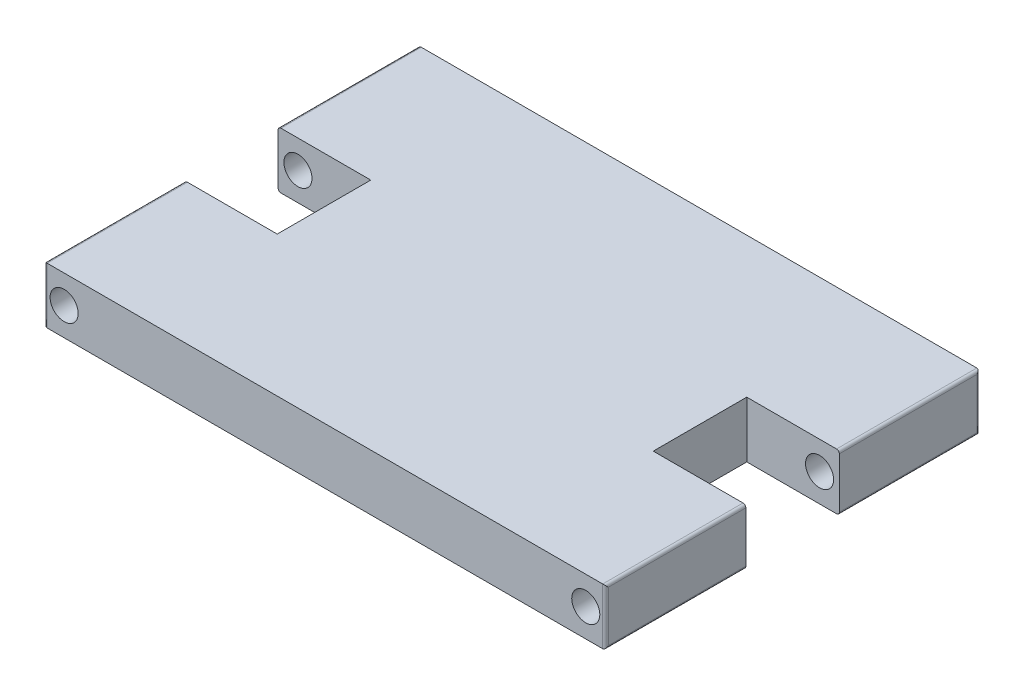
ISO-10303-21;
HEADER;
FILE_DESCRIPTION(('STEP AP214'),'2;1');
FILE_NAME('part.step','',(''),(''),'','','');
FILE_SCHEMA(('AUTOMOTIVE_DESIGN { 1 0 10303 214 1 1 1 1 }'));
ENDSEC;
DATA;
#1=APPLICATION_CONTEXT('core data for automotive mechanical design processes');
#2=APPLICATION_PROTOCOL_DEFINITION('international standard','automotive_design',2000,#1);
#3=PRODUCT_CONTEXT('',#1,'mechanical');
#4=PRODUCT('Part','Part','',(#3));
#5=PRODUCT_RELATED_PRODUCT_CATEGORY('part','',(#4));
#6=PRODUCT_DEFINITION_FORMATION('','',#4);
#7=PRODUCT_DEFINITION_CONTEXT('part definition',#1,'design');
#8=PRODUCT_DEFINITION('design','',#6,#7);
#9=PRODUCT_DEFINITION_SHAPE('','',#8);
#10=(LENGTH_UNIT() NAMED_UNIT(*) SI_UNIT(.MILLI.,.METRE.));
#11=(NAMED_UNIT(*) PLANE_ANGLE_UNIT() SI_UNIT($,.RADIAN.));
#12=(NAMED_UNIT(*) SI_UNIT($,.STERADIAN.) SOLID_ANGLE_UNIT());
#13=UNCERTAINTY_MEASURE_WITH_UNIT(LENGTH_MEASURE(1.E-05),#10,'distance_accuracy_value','');
#14=(GEOMETRIC_REPRESENTATION_CONTEXT(3) GLOBAL_UNCERTAINTY_ASSIGNED_CONTEXT((#13)) GLOBAL_UNIT_ASSIGNED_CONTEXT((#10,
#11,#12)) REPRESENTATION_CONTEXT('',''));
#15=CARTESIAN_POINT('',(0.,0.,0.));
#16=DIRECTION('',(0.,0.,1.));
#17=DIRECTION('',(1.,0.,0.));
#18=AXIS2_PLACEMENT_3D('',#15,#16,#17);
#19=CARTESIAN_POINT('',(0.,60.,-3.00000000000002));
#20=DIRECTION('',(1.,0.,0.));
#21=DIRECTION('',(0.,0.,-1.));
#22=AXIS2_PLACEMENT_3D('',#19,#20,#21);
#23=PLANE('',#22);
#24=DIRECTION('',(0.,1.,0.));
#25=VECTOR('',#24,1.);
#26=CARTESIAN_POINT('',(0.,60.,-150.));
#27=LINE('',#26,#25);
#28=CARTESIAN_POINT('',(0.,3.,-150.));
#29=VERTEX_POINT('',#28);
#30=CARTESIAN_POINT('',(0.,56.9999999999999,-150.));
#31=VERTEX_POINT('',#30);
#32=EDGE_CURVE('E280',#29,#31,#27,.T.);
#33=ORIENTED_EDGE('',*,*,#32,.F.);
#34=DIRECTION('',(0.,0.,1.));
#35=VECTOR('',#34,1.);
#36=CARTESIAN_POINT('',(0.,3.00000000000002,-400.));
#37=LINE('',#36,#35);
#38=CARTESIAN_POINT('',(0.,3.00000000000002,-3.));
#39=VERTEX_POINT('',#38);
#40=EDGE_CURVE('E297',#29,#39,#37,.T.);
#41=ORIENTED_EDGE('',*,*,#40,.T.);
#42=DIRECTION('',(0.,-1.,0.));
#43=VECTOR('',#42,1.);
#44=CARTESIAN_POINT('',(0.,60.,-3.00000000000002));
#45=LINE('',#44,#43);
#46=CARTESIAN_POINT('',(0.,56.9999999999999,-3.));
#47=VERTEX_POINT('',#46);
#48=EDGE_CURVE('E436',#47,#39,#45,.T.);
#49=ORIENTED_EDGE('',*,*,#48,.F.);
#50=DIRECTION('',(0.,0.,1.));
#51=VECTOR('',#50,1.);
#52=CARTESIAN_POINT('',(0.,56.9999999999999,-400.));
#53=LINE('',#52,#51);
#54=EDGE_CURVE('E298',#31,#47,#53,.T.);
#55=ORIENTED_EDGE('',*,*,#54,.F.);
#56=EDGE_LOOP('',(#33,#41,#49,#55));
#57=FACE_BOUND('',#56,.T.);
#58=ADVANCED_FACE('F40',(#57),#23,.F.);
#59=DIRECTION('',(0.,-1.,0.));
#60=VECTOR('',#59,1.);
#61=CARTESIAN_POINT('',(0.,60.,-250.));
#62=LINE('',#61,#60);
#63=CARTESIAN_POINT('',(0.,56.9999999999999,-250.));
#64=VERTEX_POINT('',#63);
#65=CARTESIAN_POINT('',(0.,3.,-250.));
#66=VERTEX_POINT('',#65);
#67=EDGE_CURVE('E266',#64,#66,#62,.T.);
#68=ORIENTED_EDGE('',*,*,#67,.F.);
#69=CARTESIAN_POINT('',(0.,56.9999999999999,-397.));
#70=VERTEX_POINT('',#69);
#71=EDGE_CURVE('E293',#70,#64,#53,.T.);
#72=ORIENTED_EDGE('',*,*,#71,.F.);
#73=DIRECTION('',(0.,-1.,0.));
#74=VECTOR('',#73,1.);
#75=CARTESIAN_POINT('',(0.,60.,-397.));
#76=LINE('',#75,#74);
#77=CARTESIAN_POINT('',(0.,3.00000000000002,-397.));
#78=VERTEX_POINT('',#77);
#79=EDGE_CURVE('E440',#70,#78,#76,.T.);
#80=ORIENTED_EDGE('',*,*,#79,.T.);
#81=EDGE_CURVE('E299',#78,#66,#37,.T.);
#82=ORIENTED_EDGE('',*,*,#81,.T.);
#83=EDGE_LOOP('',(#68,#72,#80,#82));
#84=FACE_BOUND('',#83,.T.);
#85=ADVANCED_FACE('F486',(#84),#23,.F.);
#86=CARTESIAN_POINT('',(600.,60.,-3.));
#87=DIRECTION('',(-1.,0.,0.));
#88=DIRECTION('',(0.,0.,1.));
#89=AXIS2_PLACEMENT_3D('',#86,#87,#88);
#90=PLANE('',#89);
#91=DIRECTION('',(0.,-1.,0.));
#92=VECTOR('',#91,1.);
#93=CARTESIAN_POINT('',(600.,60.,-150.));
#94=LINE('',#93,#92);
#95=CARTESIAN_POINT('',(600.,57.,-150.));
#96=VERTEX_POINT('',#95);
#97=CARTESIAN_POINT('',(600.,3.,-150.));
#98=VERTEX_POINT('',#97);
#99=EDGE_CURVE('E253',#96,#98,#94,.T.);
#100=ORIENTED_EDGE('',*,*,#99,.F.);
#101=DIRECTION('',(0.,0.,1.));
#102=VECTOR('',#101,1.);
#103=CARTESIAN_POINT('',(600.,57.,-400.));
#104=LINE('',#103,#102);
#105=CARTESIAN_POINT('',(600.,57.,-3.));
#106=VERTEX_POINT('',#105);
#107=EDGE_CURVE('E400',#96,#106,#104,.T.);
#108=ORIENTED_EDGE('',*,*,#107,.T.);
#109=DIRECTION('',(0.,-1.,0.));
#110=VECTOR('',#109,1.);
#111=CARTESIAN_POINT('',(600.,60.,-3.));
#112=LINE('',#111,#110);
#113=CARTESIAN_POINT('',(600.,3.,-3.));
#114=VERTEX_POINT('',#113);
#115=EDGE_CURVE('E429',#106,#114,#112,.T.);
#116=ORIENTED_EDGE('',*,*,#115,.T.);
#117=DIRECTION('',(0.,0.,1.));
#118=VECTOR('',#117,1.);
#119=CARTESIAN_POINT('',(600.,3.,-400.));
#120=LINE('',#119,#118);
#121=EDGE_CURVE('E410',#98,#114,#120,.T.);
#122=ORIENTED_EDGE('',*,*,#121,.F.);
#123=EDGE_LOOP('',(#100,#108,#116,#122));
#124=FACE_BOUND('',#123,.T.);
#125=ADVANCED_FACE('F492',(#124),#90,.F.);
#126=DIRECTION('',(0.,1.,0.));
#127=VECTOR('',#126,1.);
#128=CARTESIAN_POINT('',(600.,60.,-250.));
#129=LINE('',#128,#127);
#130=CARTESIAN_POINT('',(600.,3.,-250.));
#131=VERTEX_POINT('',#130);
#132=CARTESIAN_POINT('',(600.,57.,-250.));
#133=VERTEX_POINT('',#132);
#134=EDGE_CURVE('E67',#131,#133,#129,.T.);
#135=ORIENTED_EDGE('',*,*,#134,.F.);
#136=CARTESIAN_POINT('',(600.,3.,-397.));
#137=VERTEX_POINT('',#136);
#138=EDGE_CURVE('E305',#137,#131,#120,.T.);
#139=ORIENTED_EDGE('',*,*,#138,.F.);
#140=DIRECTION('',(0.,-1.,0.));
#141=VECTOR('',#140,1.);
#142=CARTESIAN_POINT('',(600.,60.,-397.));
#143=LINE('',#142,#141);
#144=CARTESIAN_POINT('',(600.,57.,-397.));
#145=VERTEX_POINT('',#144);
#146=EDGE_CURVE('E332',#145,#137,#143,.T.);
#147=ORIENTED_EDGE('',*,*,#146,.F.);
#148=EDGE_CURVE('E397',#145,#133,#104,.T.);
#149=ORIENTED_EDGE('',*,*,#148,.T.);
#150=EDGE_LOOP('',(#135,#139,#147,#149));
#151=FACE_BOUND('',#150,.T.);
#152=ADVANCED_FACE('F547',(#151),#90,.F.);
#153=CARTESIAN_POINT('',(597.,60.,-397.));
#154=DIRECTION('',(0.,-1.,0.));
#155=DIRECTION('',(0.,0.,-1.));
#156=AXIS2_PLACEMENT_3D('',#153,#154,#155);
#157=PLANE('',#156);
#158=DIRECTION('',(1.,0.,0.));
#159=VECTOR('',#158,1.);
#160=CARTESIAN_POINT('',(597.,60.,-150.));
#161=LINE('',#160,#159);
#162=CARTESIAN_POINT('',(3.,59.9999999999999,-150.));
#163=VERTEX_POINT('',#162);
#164=CARTESIAN_POINT('',(99.,60.,-150.));
#165=VERTEX_POINT('',#164);
#166=EDGE_CURVE('E189',#163,#165,#161,.T.);
#167=ORIENTED_EDGE('',*,*,#166,.F.);
#168=DIRECTION('',(0.,0.,1.));
#169=VECTOR('',#168,1.);
#170=CARTESIAN_POINT('',(3.,60.,-400.));
#171=LINE('',#170,#169);
#172=CARTESIAN_POINT('',(3.00000000000001,60.,0.));
#173=VERTEX_POINT('',#172);
#174=EDGE_CURVE('E364',#163,#173,#171,.T.);
#175=ORIENTED_EDGE('',*,*,#174,.T.);
#176=DIRECTION('',(1.,0.,0.));
#177=VECTOR('',#176,1.);
#178=CARTESIAN_POINT('',(597.,60.,0.));
#179=LINE('',#178,#177);
#180=CARTESIAN_POINT('',(597.,60.,0.));
#181=VERTEX_POINT('',#180);
#182=EDGE_CURVE('E328',#173,#181,#179,.T.);
#183=ORIENTED_EDGE('',*,*,#182,.T.);
#184=DIRECTION('',(0.,0.,1.));
#185=VECTOR('',#184,1.);
#186=CARTESIAN_POINT('',(597.,59.9999999999999,-400.));
#187=LINE('',#186,#185);
#188=CARTESIAN_POINT('',(597.,59.9999999999999,-150.));
#189=VERTEX_POINT('',#188);
#190=EDGE_CURVE('E292',#189,#181,#187,.T.);
#191=ORIENTED_EDGE('',*,*,#190,.F.);
#192=DIRECTION('',(1.,0.,0.));
#193=VECTOR('',#192,1.);
#194=CARTESIAN_POINT('',(597.,60.,-150.));
#195=LINE('',#194,#193);
#196=CARTESIAN_POINT('',(501.,60.,-150.));
#197=VERTEX_POINT('',#196);
#198=EDGE_CURVE('E250',#197,#189,#195,.T.);
#199=ORIENTED_EDGE('',*,*,#198,.F.);
#200=DIRECTION('',(0.,0.,1.));
#201=VECTOR('',#200,1.);
#202=CARTESIAN_POINT('',(501.,60.,-397.));
#203=LINE('',#202,#201);
#204=CARTESIAN_POINT('',(501.,60.,-250.));
#205=VERTEX_POINT('',#204);
#206=EDGE_CURVE('E286',#205,#197,#203,.T.);
#207=ORIENTED_EDGE('',*,*,#206,.F.);
#208=DIRECTION('',(-1.,0.,0.));
#209=VECTOR('',#208,1.);
#210=CARTESIAN_POINT('',(597.,60.,-250.));
#211=LINE('',#210,#209);
#212=CARTESIAN_POINT('',(597.,59.9999999999999,-250.));
#213=VERTEX_POINT('',#212);
#214=EDGE_CURVE('E236',#213,#205,#211,.T.);
#215=ORIENTED_EDGE('',*,*,#214,.F.);
#216=CARTESIAN_POINT('',(597.,60.,-400.));
#217=VERTEX_POINT('',#216);
#218=EDGE_CURVE('E360',#217,#213,#187,.T.);
#219=ORIENTED_EDGE('',*,*,#218,.F.);
#220=DIRECTION('',(-1.,0.,0.));
#221=VECTOR('',#220,1.);
#222=CARTESIAN_POINT('',(3.,60.,-400.));
#223=LINE('',#222,#221);
#224=CARTESIAN_POINT('',(3.,60.,-400.));
#225=VERTEX_POINT('',#224);
#226=EDGE_CURVE('E333',#217,#225,#223,.T.);
#227=ORIENTED_EDGE('',*,*,#226,.T.);
#228=CARTESIAN_POINT('',(3.,60.,-250.));
#229=VERTEX_POINT('',#228);
#230=EDGE_CURVE('E371',#225,#229,#171,.T.);
#231=ORIENTED_EDGE('',*,*,#230,.T.);
#232=DIRECTION('',(-1.,0.,0.));
#233=VECTOR('',#232,1.);
#234=CARTESIAN_POINT('',(597.,60.,-250.));
#235=LINE('',#234,#233);
#236=CARTESIAN_POINT('',(99.,60.,-250.));
#237=VERTEX_POINT('',#236);
#238=EDGE_CURVE('E59',#237,#229,#235,.T.);
#239=ORIENTED_EDGE('',*,*,#238,.F.);
#240=DIRECTION('',(0.,0.,-1.));
#241=VECTOR('',#240,1.);
#242=CARTESIAN_POINT('',(99.,60.,-397.));
#243=LINE('',#242,#241);
#244=EDGE_CURVE('E289',#165,#237,#243,.T.);
#245=ORIENTED_EDGE('',*,*,#244,.F.);
#246=EDGE_LOOP('',(#167,#175,#183,#191,#199,#207,#215,#219,#227,#231,#239,#245));
#247=FACE_BOUND('',#246,.T.);
#248=ADVANCED_FACE('F527',(#247),#157,.F.);
#249=CARTESIAN_POINT('',(597.,0.,-397.));
#250=DIRECTION('',(0.,-1.,0.));
#251=DIRECTION('',(0.,0.,-1.));
#252=AXIS2_PLACEMENT_3D('',#249,#250,#251);
#253=PLANE('',#252);
#254=DIRECTION('',(0.,0.,1.));
#255=VECTOR('',#254,1.);
#256=CARTESIAN_POINT('',(3.00000000000002,0.,-400.));
#257=LINE('',#256,#255);
#258=CARTESIAN_POINT('',(3.,0.,-150.));
#259=VERTEX_POINT('',#258);
#260=CARTESIAN_POINT('',(3.,0.,1.19999999968419E-05));
#261=VERTEX_POINT('',#260);
#262=EDGE_CURVE('E44',#259,#261,#257,.T.);
#263=ORIENTED_EDGE('',*,*,#262,.F.);
#264=DIRECTION('',(1.,0.,0.));
#265=VECTOR('',#264,1.);
#266=CARTESIAN_POINT('',(-0.999999999999969,0.,-150.));
#267=LINE('',#266,#265);
#268=CARTESIAN_POINT('',(99.,0.,-150.));
#269=VERTEX_POINT('',#268);
#270=EDGE_CURVE('E186',#259,#269,#267,.T.);
#271=ORIENTED_EDGE('',*,*,#270,.T.);
#272=DIRECTION('',(0.,0.,-1.));
#273=VECTOR('',#272,1.);
#274=CARTESIAN_POINT('',(99.,0.,-250.));
#275=LINE('',#274,#273);
#276=CARTESIAN_POINT('',(99.,0.,-250.));
#277=VERTEX_POINT('',#276);
#278=EDGE_CURVE('E197',#269,#277,#275,.T.);
#279=ORIENTED_EDGE('',*,*,#278,.T.);
#280=DIRECTION('',(-1.,0.,0.));
#281=VECTOR('',#280,1.);
#282=CARTESIAN_POINT('',(-0.999999999999981,0.,-250.));
#283=LINE('',#282,#281);
#284=CARTESIAN_POINT('',(3.,0.,-250.));
#285=VERTEX_POINT('',#284);
#286=EDGE_CURVE('E203',#277,#285,#283,.T.);
#287=ORIENTED_EDGE('',*,*,#286,.T.);
#288=CARTESIAN_POINT('',(3.,0.,-400.));
#289=VERTEX_POINT('',#288);
#290=EDGE_CURVE('E315',#289,#285,#257,.T.);
#291=ORIENTED_EDGE('',*,*,#290,.F.);
#292=DIRECTION('',(-1.,0.,0.));
#293=VECTOR('',#292,1.);
#294=CARTESIAN_POINT('',(3.,0.,-400.));
#295=LINE('',#294,#293);
#296=CARTESIAN_POINT('',(597.,0.,-400.));
#297=VERTEX_POINT('',#296);
#298=EDGE_CURVE('E340',#297,#289,#295,.T.);
#299=ORIENTED_EDGE('',*,*,#298,.F.);
#300=DIRECTION('',(0.,0.,1.));
#301=VECTOR('',#300,1.);
#302=CARTESIAN_POINT('',(597.,0.,-400.));
#303=LINE('',#302,#301);
#304=CARTESIAN_POINT('',(597.,0.,-250.));
#305=VERTEX_POINT('',#304);
#306=EDGE_CURVE('E309',#297,#305,#303,.T.);
#307=ORIENTED_EDGE('',*,*,#306,.T.);
#308=DIRECTION('',(-1.,0.,0.));
#309=VECTOR('',#308,1.);
#310=CARTESIAN_POINT('',(501.,0.,-250.));
#311=LINE('',#310,#309);
#312=CARTESIAN_POINT('',(501.,0.,-250.));
#313=VERTEX_POINT('',#312);
#314=EDGE_CURVE('E227',#305,#313,#311,.T.);
#315=ORIENTED_EDGE('',*,*,#314,.T.);
#316=DIRECTION('',(0.,0.,1.));
#317=VECTOR('',#316,1.);
#318=CARTESIAN_POINT('',(501.,0.,-250.));
#319=LINE('',#318,#317);
#320=CARTESIAN_POINT('',(501.,0.,-150.));
#321=VERTEX_POINT('',#320);
#322=EDGE_CURVE('E219',#313,#321,#319,.T.);
#323=ORIENTED_EDGE('',*,*,#322,.T.);
#324=DIRECTION('',(1.,0.,0.));
#325=VECTOR('',#324,1.);
#326=CARTESIAN_POINT('',(501.,0.,-150.));
#327=LINE('',#326,#325);
#328=CARTESIAN_POINT('',(597.,0.,-150.));
#329=VERTEX_POINT('',#328);
#330=EDGE_CURVE('E223',#321,#329,#327,.T.);
#331=ORIENTED_EDGE('',*,*,#330,.T.);
#332=CARTESIAN_POINT('',(597.,0.,0.));
#333=VERTEX_POINT('',#332);
#334=EDGE_CURVE('E312',#329,#333,#303,.T.);
#335=ORIENTED_EDGE('',*,*,#334,.T.);
#336=DIRECTION('',(1.,0.,0.));
#337=VECTOR('',#336,1.);
#338=CARTESIAN_POINT('',(3.00000000000002,0.,0.));
#339=LINE('',#338,#337);
#340=EDGE_CURVE('E336',#261,#333,#339,.T.);
#341=ORIENTED_EDGE('',*,*,#340,.F.);
#342=EDGE_LOOP('',(#263,#271,#279,#287,#291,#299,#307,#315,#323,#331,#335,#341));
#343=FACE_BOUND('',#342,.T.);
#344=ADVANCED_FACE('F206',(#343),#253,.T.);
#345=CARTESIAN_POINT('',(3.,3.,-400.));
#346=DIRECTION('',(0.,0.,1.));
#347=DIRECTION('',(1.,0.,0.));
#348=AXIS2_PLACEMENT_3D('',#345,#346,#347);
#349=CYLINDRICAL_SURFACE('',#348,3.);
#350=ORIENTED_EDGE('',*,*,#40,.F.);
#351=CARTESIAN_POINT('',(3.,3.,-150.));
#352=DIRECTION('',(0.,0.,-1.));
#353=DIRECTION('',(-1.,0.,0.));
#354=AXIS2_PLACEMENT_3D('',#351,#352,#353);
#355=CIRCLE('',#354,3.);
#356=EDGE_CURVE('E283',#29,#259,#355,.F.);
#357=ORIENTED_EDGE('',*,*,#356,.T.);
#358=ORIENTED_EDGE('',*,*,#262,.T.);
#359=CARTESIAN_POINT('',(3.,3.,-3.));
#360=DIRECTION('',(0.,-0.707106781186547,-0.707106781186547));
#361=DIRECTION('',(0.,-0.707106781186547,0.707106781186547));
#362=AXIS2_PLACEMENT_3D('',#359,#360,#361);
#363=ELLIPSE('',#362,4.24264068711928,3.);
#364=EDGE_CURVE('E379',#261,#39,#363,.T.);
#365=ORIENTED_EDGE('',*,*,#364,.T.);
#366=EDGE_LOOP('',(#350,#357,#358,#365));
#367=FACE_BOUND('',#366,.T.);
#368=ADVANCED_FACE('F481',(#367),#349,.T.);
#369=ORIENTED_EDGE('',*,*,#290,.T.);
#370=CARTESIAN_POINT('',(3.,3.,-250.));
#371=DIRECTION('',(0.,0.,1.));
#372=DIRECTION('',(1.,0.,0.));
#373=AXIS2_PLACEMENT_3D('',#370,#371,#372);
#374=CIRCLE('',#373,3.);
#375=EDGE_CURVE('E269',#285,#66,#374,.F.);
#376=ORIENTED_EDGE('',*,*,#375,.T.);
#377=ORIENTED_EDGE('',*,*,#81,.F.);
#378=CARTESIAN_POINT('',(3.,3.,-397.));
#379=DIRECTION('',(0.,-0.707106781186547,0.707106781186547));
#380=DIRECTION('',(0.,-0.707106781186547,-0.707106781186547));
#381=AXIS2_PLACEMENT_3D('',#378,#379,#380);
#382=ELLIPSE('',#381,4.24264068711929,3.);
#383=EDGE_CURVE('E350',#78,#289,#382,.T.);
#384=ORIENTED_EDGE('',*,*,#383,.T.);
#385=EDGE_LOOP('',(#369,#376,#377,#384));
#386=FACE_BOUND('',#385,.T.);
#387=ADVANCED_FACE('F474',(#386),#349,.T.);
#388=CARTESIAN_POINT('',(597.,3.,-400.));
#389=DIRECTION('',(0.,0.,1.));
#390=DIRECTION('',(1.,0.,0.));
#391=AXIS2_PLACEMENT_3D('',#388,#389,#390);
#392=CYLINDRICAL_SURFACE('',#391,2.99999999999991);
#393=ORIENTED_EDGE('',*,*,#334,.F.);
#394=CARTESIAN_POINT('',(597.,3.,-150.));
#395=DIRECTION('',(0.,0.,-1.));
#396=DIRECTION('',(-1.,0.,0.));
#397=AXIS2_PLACEMENT_3D('',#394,#395,#396);
#398=CIRCLE('',#397,2.99999999999991);
#399=EDGE_CURVE('E256',#329,#98,#398,.F.);
#400=ORIENTED_EDGE('',*,*,#399,.T.);
#401=ORIENTED_EDGE('',*,*,#121,.T.);
#402=CARTESIAN_POINT('',(597.,3.,-3.));
#403=DIRECTION('',(0.,-0.707106781186547,-0.707106781186547));
#404=DIRECTION('',(0.,-0.707106781186547,0.707106781186547));
#405=AXIS2_PLACEMENT_3D('',#402,#403,#404);
#406=ELLIPSE('',#405,4.24264068711922,2.99999999999996);
#407=EDGE_CURVE('E345',#114,#333,#406,.T.);
#408=ORIENTED_EDGE('',*,*,#407,.T.);
#409=EDGE_LOOP('',(#393,#400,#401,#408));
#410=FACE_BOUND('',#409,.T.);
#411=ADVANCED_FACE('F472',(#410),#392,.T.);
#412=ORIENTED_EDGE('',*,*,#138,.T.);
#413=CARTESIAN_POINT('',(597.,3.,-250.));
#414=DIRECTION('',(0.,0.,1.));
#415=DIRECTION('',(1.,0.,0.));
#416=AXIS2_PLACEMENT_3D('',#413,#414,#415);
#417=CIRCLE('',#416,2.99999999999991);
#418=EDGE_CURVE('E241',#131,#305,#417,.F.);
#419=ORIENTED_EDGE('',*,*,#418,.T.);
#420=ORIENTED_EDGE('',*,*,#306,.F.);
#421=CARTESIAN_POINT('',(597.,3.,-397.));
#422=DIRECTION('',(0.,-0.707106781186547,0.707106781186547));
#423=DIRECTION('',(0.,-0.707106781186547,-0.707106781186547));
#424=AXIS2_PLACEMENT_3D('',#421,#422,#423);
#425=ELLIPSE('',#424,4.24264068711922,2.99999999999996);
#426=EDGE_CURVE('E349',#297,#137,#425,.T.);
#427=ORIENTED_EDGE('',*,*,#426,.T.);
#428=EDGE_LOOP('',(#412,#419,#420,#427));
#429=FACE_BOUND('',#428,.T.);
#430=ADVANCED_FACE('F423',(#429),#392,.T.);
#431=CARTESIAN_POINT('',(3.,56.9999999999999,-400.));
#432=DIRECTION('',(0.,0.,1.));
#433=DIRECTION('',(1.,0.,0.));
#434=AXIS2_PLACEMENT_3D('',#431,#432,#433);
#435=CYLINDRICAL_SURFACE('',#434,2.99999999999999);
#436=ORIENTED_EDGE('',*,*,#174,.F.);
#437=CARTESIAN_POINT('',(3.,56.9999999999999,-150.));
#438=DIRECTION('',(0.,0.,-1.));
#439=DIRECTION('',(-1.,0.,0.));
#440=AXIS2_PLACEMENT_3D('',#437,#438,#439);
#441=CIRCLE('',#440,2.99999999999999);
#442=EDGE_CURVE('E274',#163,#31,#441,.F.);
#443=ORIENTED_EDGE('',*,*,#442,.T.);
#444=ORIENTED_EDGE('',*,*,#54,.T.);
#445=CARTESIAN_POINT('',(3.,56.9999999999999,-3.));
#446=DIRECTION('',(0.,-0.707106781186547,0.707106781186547));
#447=DIRECTION('',(0.,-0.707106781186547,-0.707106781186547));
#448=AXIS2_PLACEMENT_3D('',#445,#446,#447);
#449=ELLIPSE('',#448,4.24264068711928,3.);
#450=EDGE_CURVE('E367',#47,#173,#449,.F.);
#451=ORIENTED_EDGE('',*,*,#450,.T.);
#452=EDGE_LOOP('',(#436,#443,#444,#451));
#453=FACE_BOUND('',#452,.T.);
#454=ADVANCED_FACE('F480',(#453),#435,.T.);
#455=ORIENTED_EDGE('',*,*,#71,.T.);
#456=CARTESIAN_POINT('',(3.,56.9999999999999,-250.));
#457=DIRECTION('',(0.,0.,1.));
#458=DIRECTION('',(1.,0.,0.));
#459=AXIS2_PLACEMENT_3D('',#456,#457,#458);
#460=CIRCLE('',#459,2.99999999999999);
#461=EDGE_CURVE('E261',#64,#229,#460,.F.);
#462=ORIENTED_EDGE('',*,*,#461,.T.);
#463=ORIENTED_EDGE('',*,*,#230,.F.);
#464=CARTESIAN_POINT('',(3.,56.9999999999999,-397.));
#465=DIRECTION('',(0.,-0.707106781186547,-0.707106781186547));
#466=DIRECTION('',(0.,-0.707106781186547,0.707106781186547));
#467=AXIS2_PLACEMENT_3D('',#464,#465,#466);
#468=ELLIPSE('',#467,4.24264068711928,3.);
#469=EDGE_CURVE('E359',#225,#70,#468,.F.);
#470=ORIENTED_EDGE('',*,*,#469,.T.);
#471=EDGE_LOOP('',(#455,#462,#463,#470));
#472=FACE_BOUND('',#471,.T.);
#473=ADVANCED_FACE('F569',(#472),#435,.T.);
#474=CARTESIAN_POINT('',(597.,57.,-400.));
#475=DIRECTION('',(0.,0.,1.));
#476=DIRECTION('',(1.,0.,0.));
#477=AXIS2_PLACEMENT_3D('',#474,#475,#476);
#478=CYLINDRICAL_SURFACE('',#477,2.99999999999991);
#479=ORIENTED_EDGE('',*,*,#107,.F.);
#480=CARTESIAN_POINT('',(597.,57.,-150.));
#481=DIRECTION('',(0.,0.,-1.));
#482=DIRECTION('',(-1.,0.,0.));
#483=AXIS2_PLACEMENT_3D('',#480,#481,#482);
#484=CIRCLE('',#483,2.99999999999991);
#485=EDGE_CURVE('E246',#96,#189,#484,.F.);
#486=ORIENTED_EDGE('',*,*,#485,.T.);
#487=ORIENTED_EDGE('',*,*,#190,.T.);
#488=CARTESIAN_POINT('',(597.,57.,-3.));
#489=DIRECTION('',(0.,-0.707106781186547,0.707106781186547));
#490=DIRECTION('',(0.,-0.707106781186547,-0.707106781186547));
#491=AXIS2_PLACEMENT_3D('',#488,#489,#490);
#492=ELLIPSE('',#491,4.24264068711922,2.99999999999996);
#493=EDGE_CURVE('E355',#181,#106,#492,.F.);
#494=ORIENTED_EDGE('',*,*,#493,.T.);
#495=EDGE_LOOP('',(#479,#486,#487,#494));
#496=FACE_BOUND('',#495,.T.);
#497=ADVANCED_FACE('F545',(#496),#478,.T.);
#498=ORIENTED_EDGE('',*,*,#218,.T.);
#499=CARTESIAN_POINT('',(597.,57.,-250.));
#500=DIRECTION('',(0.,0.,1.));
#501=DIRECTION('',(1.,0.,0.));
#502=AXIS2_PLACEMENT_3D('',#499,#500,#501);
#503=CIRCLE('',#502,2.99999999999991);
#504=EDGE_CURVE('E233',#213,#133,#503,.F.);
#505=ORIENTED_EDGE('',*,*,#504,.T.);
#506=ORIENTED_EDGE('',*,*,#148,.F.);
#507=CARTESIAN_POINT('',(597.,57.,-397.));
#508=DIRECTION('',(0.,-0.707106781186547,-0.707106781186547));
#509=DIRECTION('',(0.,-0.707106781186547,0.707106781186547));
#510=AXIS2_PLACEMENT_3D('',#507,#508,#509);
#511=ELLIPSE('',#510,4.24264068711922,2.99999999999996);
#512=EDGE_CURVE('E351',#145,#217,#511,.F.);
#513=ORIENTED_EDGE('',*,*,#512,.T.);
#514=EDGE_LOOP('',(#498,#505,#506,#513));
#515=FACE_BOUND('',#514,.T.);
#516=ADVANCED_FACE('F532',(#515),#478,.T.);
#517=CARTESIAN_POINT('',(21.15,30.,-400.));
#518=DIRECTION('',(0.,0.,1.));
#519=DIRECTION('',(1.,0.,0.));
#520=AXIS2_PLACEMENT_3D('',#517,#518,#519);
#521=CYLINDRICAL_SURFACE('',#520,15.);
#522=CARTESIAN_POINT('',(21.15,30.,0.));
#523=DIRECTION('',(0.,0.,-1.));
#524=DIRECTION('',(-1.,0.,0.));
#525=AXIS2_PLACEMENT_3D('',#522,#523,#524);
#526=CIRCLE('',#525,15.);
#527=CARTESIAN_POINT('',(6.14999999999992,30.,0.));
#528=VERTEX_POINT('',#527);
#529=EDGE_CURVE('E354',#528,#528,#526,.T.);
#530=ORIENTED_EDGE('',*,*,#529,.F.);
#531=EDGE_LOOP('',(#530));
#532=FACE_BOUND('',#531,.T.);
#533=CARTESIAN_POINT('',(21.15,30.,-150.));
#534=DIRECTION('',(0.,0.,-1.));
#535=DIRECTION('',(-1.,0.,0.));
#536=AXIS2_PLACEMENT_3D('',#533,#534,#535);
#537=CIRCLE('',#536,15.);
#538=CARTESIAN_POINT('',(6.14999999999992,30.,-150.));
#539=VERTEX_POINT('',#538);
#540=EDGE_CURVE('E273',#539,#539,#537,.F.);
#541=ORIENTED_EDGE('',*,*,#540,.F.);
#542=EDGE_LOOP('',(#541));
#543=FACE_BOUND('',#542,.T.);
#544=ADVANCED_FACE('F557',(#532,#543),#521,.F.);
#545=CARTESIAN_POINT('',(21.15,30.,-400.));
#546=DIRECTION('',(0.,0.,1.));
#547=DIRECTION('',(1.,0.,0.));
#548=AXIS2_PLACEMENT_3D('',#545,#546,#547);
#549=CIRCLE('',#548,15.);
#550=CARTESIAN_POINT('',(36.15,30.,-400.));
#551=VERTEX_POINT('',#550);
#552=EDGE_CURVE('E384',#551,#551,#549,.T.);
#553=ORIENTED_EDGE('',*,*,#552,.F.);
#554=EDGE_LOOP('',(#553));
#555=FACE_BOUND('',#554,.T.);
#556=CARTESIAN_POINT('',(21.15,30.,-250.));
#557=DIRECTION('',(0.,0.,1.));
#558=DIRECTION('',(1.,0.,0.));
#559=AXIS2_PLACEMENT_3D('',#556,#557,#558);
#560=CIRCLE('',#559,15.);
#561=CARTESIAN_POINT('',(36.15,30.,-250.));
#562=VERTEX_POINT('',#561);
#563=EDGE_CURVE('E260',#562,#562,#560,.F.);
#564=ORIENTED_EDGE('',*,*,#563,.F.);
#565=EDGE_LOOP('',(#564));
#566=FACE_BOUND('',#565,.T.);
#567=ADVANCED_FACE('F560',(#555,#566),#521,.F.);
#568=CARTESIAN_POINT('',(578.85,30.,-400.));
#569=DIRECTION('',(0.,0.,1.));
#570=DIRECTION('',(1.,0.,0.));
#571=AXIS2_PLACEMENT_3D('',#568,#569,#570);
#572=CYLINDRICAL_SURFACE('',#571,15.);
#573=CARTESIAN_POINT('',(578.85,30.,0.));
#574=DIRECTION('',(0.,0.,-1.));
#575=DIRECTION('',(-1.,0.,0.));
#576=AXIS2_PLACEMENT_3D('',#573,#574,#575);
#577=CIRCLE('',#576,15.);
#578=CARTESIAN_POINT('',(563.85,30.,0.));
#579=VERTEX_POINT('',#578);
#580=EDGE_CURVE('E451',#579,#579,#577,.T.);
#581=ORIENTED_EDGE('',*,*,#580,.F.);
#582=EDGE_LOOP('',(#581));
#583=FACE_BOUND('',#582,.T.);
#584=CARTESIAN_POINT('',(578.85,30.,-150.));
#585=DIRECTION('',(0.,0.,-1.));
#586=DIRECTION('',(-1.,0.,0.));
#587=AXIS2_PLACEMENT_3D('',#584,#585,#586);
#588=CIRCLE('',#587,15.);
#589=CARTESIAN_POINT('',(563.85,30.,-150.));
#590=VERTEX_POINT('',#589);
#591=EDGE_CURVE('E245',#590,#590,#588,.F.);
#592=ORIENTED_EDGE('',*,*,#591,.F.);
#593=EDGE_LOOP('',(#592));
#594=FACE_BOUND('',#593,.T.);
#595=ADVANCED_FACE('F562',(#583,#594),#572,.F.);
#596=CARTESIAN_POINT('',(578.85,30.,-400.));
#597=DIRECTION('',(0.,0.,1.));
#598=DIRECTION('',(1.,0.,0.));
#599=AXIS2_PLACEMENT_3D('',#596,#597,#598);
#600=CIRCLE('',#599,15.);
#601=CARTESIAN_POINT('',(593.85,30.,-400.));
#602=VERTEX_POINT('',#601);
#603=EDGE_CURVE('E394',#602,#602,#600,.T.);
#604=ORIENTED_EDGE('',*,*,#603,.F.);
#605=EDGE_LOOP('',(#604));
#606=FACE_BOUND('',#605,.T.);
#607=CARTESIAN_POINT('',(578.85,30.,-250.));
#608=DIRECTION('',(0.,0.,1.));
#609=DIRECTION('',(1.,0.,0.));
#610=AXIS2_PLACEMENT_3D('',#607,#608,#609);
#611=CIRCLE('',#610,15.);
#612=CARTESIAN_POINT('',(593.85,30.,-250.));
#613=VERTEX_POINT('',#612);
#614=EDGE_CURVE('E193',#613,#613,#611,.F.);
#615=ORIENTED_EDGE('',*,*,#614,.F.);
#616=EDGE_LOOP('',(#615));
#617=FACE_BOUND('',#616,.T.);
#618=ADVANCED_FACE('F565',(#606,#617),#572,.F.);
#619=CARTESIAN_POINT('',(597.,60.,-397.));
#620=DIRECTION('',(0.,-1.,0.));
#621=DIRECTION('',(0.,0.,-1.));
#622=AXIS2_PLACEMENT_3D('',#619,#620,#621);
#623=CYLINDRICAL_SURFACE('',#622,3.);
#624=ORIENTED_EDGE('',*,*,#512,.F.);
#625=ORIENTED_EDGE('',*,*,#146,.T.);
#626=ORIENTED_EDGE('',*,*,#426,.F.);
#627=DIRECTION('',(0.,-1.,0.));
#628=VECTOR('',#627,1.);
#629=CARTESIAN_POINT('',(597.,60.,-400.));
#630=LINE('',#629,#628);
#631=EDGE_CURVE('E12',#217,#297,#630,.T.);
#632=ORIENTED_EDGE('',*,*,#631,.F.);
#633=EDGE_LOOP('',(#624,#625,#626,#632));
#634=FACE_BOUND('',#633,.T.);
#635=ADVANCED_FACE('F42',(#634),#623,.T.);
#636=CARTESIAN_POINT('',(3.,60.,-397.));
#637=DIRECTION('',(0.,-1.,0.));
#638=DIRECTION('',(0.,0.,-1.));
#639=AXIS2_PLACEMENT_3D('',#636,#637,#638);
#640=CYLINDRICAL_SURFACE('',#639,3.);
#641=ORIENTED_EDGE('',*,*,#383,.F.);
#642=ORIENTED_EDGE('',*,*,#79,.F.);
#643=ORIENTED_EDGE('',*,*,#469,.F.);
#644=DIRECTION('',(0.,-1.,0.));
#645=VECTOR('',#644,1.);
#646=CARTESIAN_POINT('',(3.,60.,-400.));
#647=LINE('',#646,#645);
#648=EDGE_CURVE('E51',#225,#289,#647,.T.);
#649=ORIENTED_EDGE('',*,*,#648,.T.);
#650=EDGE_LOOP('',(#641,#642,#643,#649));
#651=FACE_BOUND('',#650,.T.);
#652=ADVANCED_FACE('F499',(#651),#640,.T.);
#653=CARTESIAN_POINT('',(3.,60.,-3.));
#654=DIRECTION('',(0.,-1.,0.));
#655=DIRECTION('',(0.,0.,-1.));
#656=AXIS2_PLACEMENT_3D('',#653,#654,#655);
#657=CYLINDRICAL_SURFACE('',#656,3.);
#658=ORIENTED_EDGE('',*,*,#364,.F.);
#659=DIRECTION('',(0.,-1.,0.));
#660=VECTOR('',#659,1.);
#661=CARTESIAN_POINT('',(3.00000000000002,60.,0.));
#662=LINE('',#661,#660);
#663=EDGE_CURVE('E441',#173,#261,#662,.T.);
#664=ORIENTED_EDGE('',*,*,#663,.F.);
#665=ORIENTED_EDGE('',*,*,#450,.F.);
#666=ORIENTED_EDGE('',*,*,#48,.T.);
#667=EDGE_LOOP('',(#658,#664,#665,#666));
#668=FACE_BOUND('',#667,.T.);
#669=ADVANCED_FACE('F497',(#668),#657,.T.);
#670=CARTESIAN_POINT('',(597.,60.,-3.));
#671=DIRECTION('',(0.,-1.,0.));
#672=DIRECTION('',(0.,0.,-1.));
#673=AXIS2_PLACEMENT_3D('',#670,#671,#672);
#674=CYLINDRICAL_SURFACE('',#673,3.);
#675=ORIENTED_EDGE('',*,*,#493,.F.);
#676=DIRECTION('',(0.,-1.,0.));
#677=VECTOR('',#676,1.);
#678=CARTESIAN_POINT('',(597.,60.,0.));
#679=LINE('',#678,#677);
#680=EDGE_CURVE('E432',#181,#333,#679,.T.);
#681=ORIENTED_EDGE('',*,*,#680,.T.);
#682=ORIENTED_EDGE('',*,*,#407,.F.);
#683=ORIENTED_EDGE('',*,*,#115,.F.);
#684=EDGE_LOOP('',(#675,#681,#682,#683));
#685=FACE_BOUND('',#684,.T.);
#686=ADVANCED_FACE('F464',(#685),#674,.T.);
#687=CARTESIAN_POINT('',(3.,60.,-400.));
#688=DIRECTION('',(0.,0.,1.));
#689=DIRECTION('',(1.,0.,0.));
#690=AXIS2_PLACEMENT_3D('',#687,#688,#689);
#691=PLANE('',#690);
#692=ORIENTED_EDGE('',*,*,#603,.T.);
#693=EDGE_LOOP('',(#692));
#694=FACE_BOUND('',#693,.T.);
#695=ORIENTED_EDGE('',*,*,#552,.T.);
#696=EDGE_LOOP('',(#695));
#697=FACE_BOUND('',#696,.T.);
#698=ORIENTED_EDGE('',*,*,#298,.T.);
#699=ORIENTED_EDGE('',*,*,#648,.F.);
#700=ORIENTED_EDGE('',*,*,#226,.F.);
#701=ORIENTED_EDGE('',*,*,#631,.T.);
#702=EDGE_LOOP('',(#698,#699,#700,#701));
#703=FACE_BOUND('',#702,.T.);
#704=ADVANCED_FACE('F502',(#694,#697,#703),#691,.F.);
#705=CARTESIAN_POINT('',(3.00000000000002,60.,0.));
#706=DIRECTION('',(0.,0.,-1.));
#707=DIRECTION('',(-1.,0.,0.));
#708=AXIS2_PLACEMENT_3D('',#705,#706,#707);
#709=PLANE('',#708);
#710=ORIENTED_EDGE('',*,*,#580,.T.);
#711=EDGE_LOOP('',(#710));
#712=FACE_BOUND('',#711,.T.);
#713=ORIENTED_EDGE('',*,*,#529,.T.);
#714=EDGE_LOOP('',(#713));
#715=FACE_BOUND('',#714,.T.);
#716=ORIENTED_EDGE('',*,*,#340,.T.);
#717=ORIENTED_EDGE('',*,*,#680,.F.);
#718=ORIENTED_EDGE('',*,*,#182,.F.);
#719=ORIENTED_EDGE('',*,*,#663,.T.);
#720=EDGE_LOOP('',(#716,#717,#718,#719));
#721=FACE_BOUND('',#720,.T.);
#722=ADVANCED_FACE('F468',(#712,#715,#721),#709,.F.);
#723=CARTESIAN_POINT('',(501.,60.000025,-250.));
#724=DIRECTION('',(1.,0.,0.));
#725=DIRECTION('',(0.,0.,-1.));
#726=AXIS2_PLACEMENT_3D('',#723,#724,#725);
#727=PLANE('',#726);
#728=ORIENTED_EDGE('',*,*,#206,.T.);
#729=DIRECTION('',(0.,-1.,0.));
#730=VECTOR('',#729,1.);
#731=CARTESIAN_POINT('',(501.,60.000025,-150.));
#732=LINE('',#731,#730);
#733=EDGE_CURVE('E209',#197,#321,#732,.T.);
#734=ORIENTED_EDGE('',*,*,#733,.T.);
#735=ORIENTED_EDGE('',*,*,#322,.F.);
#736=DIRECTION('',(0.,-1.,0.));
#737=VECTOR('',#736,1.);
#738=CARTESIAN_POINT('',(501.,60.000025,-250.));
#739=LINE('',#738,#737);
#740=EDGE_CURVE('E212',#205,#313,#739,.T.);
#741=ORIENTED_EDGE('',*,*,#740,.F.);
#742=EDGE_LOOP('',(#728,#734,#735,#741));
#743=FACE_BOUND('',#742,.T.);
#744=ADVANCED_FACE('F509',(#743),#727,.T.);
#745=CARTESIAN_POINT('',(501.,60.000025,-150.));
#746=DIRECTION('',(0.,0.,-1.));
#747=DIRECTION('',(-1.,0.,0.));
#748=AXIS2_PLACEMENT_3D('',#745,#746,#747);
#749=PLANE('',#748);
#750=ORIENTED_EDGE('',*,*,#330,.F.);
#751=ORIENTED_EDGE('',*,*,#733,.F.);
#752=ORIENTED_EDGE('',*,*,#198,.T.);
#753=ORIENTED_EDGE('',*,*,#485,.F.);
#754=ORIENTED_EDGE('',*,*,#99,.T.);
#755=ORIENTED_EDGE('',*,*,#399,.F.);
#756=EDGE_LOOP('',(#750,#751,#752,#753,#754,#755));
#757=FACE_BOUND('',#756,.T.);
#758=ORIENTED_EDGE('',*,*,#591,.T.);
#759=EDGE_LOOP('',(#758));
#760=FACE_BOUND('',#759,.T.);
#761=ADVANCED_FACE('F542',(#757,#760),#749,.T.);
#762=CARTESIAN_POINT('',(501.,60.000025,-250.));
#763=DIRECTION('',(0.,0.,1.));
#764=DIRECTION('',(1.,0.,0.));
#765=AXIS2_PLACEMENT_3D('',#762,#763,#764);
#766=PLANE('',#765);
#767=ORIENTED_EDGE('',*,*,#134,.T.);
#768=ORIENTED_EDGE('',*,*,#504,.F.);
#769=ORIENTED_EDGE('',*,*,#214,.T.);
#770=ORIENTED_EDGE('',*,*,#740,.T.);
#771=ORIENTED_EDGE('',*,*,#314,.F.);
#772=ORIENTED_EDGE('',*,*,#418,.F.);
#773=EDGE_LOOP('',(#767,#768,#769,#770,#771,#772));
#774=FACE_BOUND('',#773,.T.);
#775=ORIENTED_EDGE('',*,*,#614,.T.);
#776=EDGE_LOOP('',(#775));
#777=FACE_BOUND('',#776,.T.);
#778=ADVANCED_FACE('F533',(#774,#777),#766,.T.);
#779=CARTESIAN_POINT('',(99.,60.000025,-250.));
#780=DIRECTION('',(-1.,0.,0.));
#781=DIRECTION('',(0.,0.,1.));
#782=AXIS2_PLACEMENT_3D('',#779,#780,#781);
#783=PLANE('',#782);
#784=ORIENTED_EDGE('',*,*,#244,.T.);
#785=DIRECTION('',(0.,-1.,0.));
#786=VECTOR('',#785,1.);
#787=CARTESIAN_POINT('',(99.,60.000025,-250.));
#788=LINE('',#787,#786);
#789=EDGE_CURVE('E194',#237,#277,#788,.T.);
#790=ORIENTED_EDGE('',*,*,#789,.T.);
#791=ORIENTED_EDGE('',*,*,#278,.F.);
#792=DIRECTION('',(0.,-1.,0.));
#793=VECTOR('',#792,1.);
#794=CARTESIAN_POINT('',(99.,60.000025,-150.));
#795=LINE('',#794,#793);
#796=EDGE_CURVE('E181',#165,#269,#795,.T.);
#797=ORIENTED_EDGE('',*,*,#796,.F.);
#798=EDGE_LOOP('',(#784,#790,#791,#797));
#799=FACE_BOUND('',#798,.T.);
#800=ADVANCED_FACE('F198',(#799),#783,.T.);
#801=CARTESIAN_POINT('',(-0.999999999999969,60.000025,-150.));
#802=DIRECTION('',(0.,0.,-1.));
#803=DIRECTION('',(-1.,0.,0.));
#804=AXIS2_PLACEMENT_3D('',#801,#802,#803);
#805=PLANE('',#804);
#806=ORIENTED_EDGE('',*,*,#32,.T.);
#807=ORIENTED_EDGE('',*,*,#442,.F.);
#808=ORIENTED_EDGE('',*,*,#166,.T.);
#809=ORIENTED_EDGE('',*,*,#796,.T.);
#810=ORIENTED_EDGE('',*,*,#270,.F.);
#811=ORIENTED_EDGE('',*,*,#356,.F.);
#812=EDGE_LOOP('',(#806,#807,#808,#809,#810,#811));
#813=FACE_BOUND('',#812,.T.);
#814=ORIENTED_EDGE('',*,*,#540,.T.);
#815=EDGE_LOOP('',(#814));
#816=FACE_BOUND('',#815,.T.);
#817=ADVANCED_FACE('F183',(#813,#816),#805,.T.);
#818=CARTESIAN_POINT('',(-0.999999999999981,60.000025,-250.));
#819=DIRECTION('',(0.,0.,1.));
#820=DIRECTION('',(1.,0.,0.));
#821=AXIS2_PLACEMENT_3D('',#818,#819,#820);
#822=PLANE('',#821);
#823=ORIENTED_EDGE('',*,*,#286,.F.);
#824=ORIENTED_EDGE('',*,*,#789,.F.);
#825=ORIENTED_EDGE('',*,*,#238,.T.);
#826=ORIENTED_EDGE('',*,*,#461,.F.);
#827=ORIENTED_EDGE('',*,*,#67,.T.);
#828=ORIENTED_EDGE('',*,*,#375,.F.);
#829=EDGE_LOOP('',(#823,#824,#825,#826,#827,#828));
#830=FACE_BOUND('',#829,.T.);
#831=ORIENTED_EDGE('',*,*,#563,.T.);
#832=EDGE_LOOP('',(#831));
#833=FACE_BOUND('',#832,.T.);
#834=ADVANCED_FACE('F755',(#830,#833),#822,.T.);
#835=CLOSED_SHELL('',(#58,#85,#125,#152,#248,#344,#368,#387,#411,#430,#454,#473,#497,#516,#544,
#567,#595,#618,#635,#652,#669,#686,#704,#722,#744,#761,#778,#800,#817,#834));
#836=MANIFOLD_SOLID_BREP('B2',#835);
#837=ADVANCED_BREP_SHAPE_REPRESENTATION('',(#18,#836),#14);
#838=SHAPE_DEFINITION_REPRESENTATION(#9,#837);
ENDSEC;
END-ISO-10303-21;
